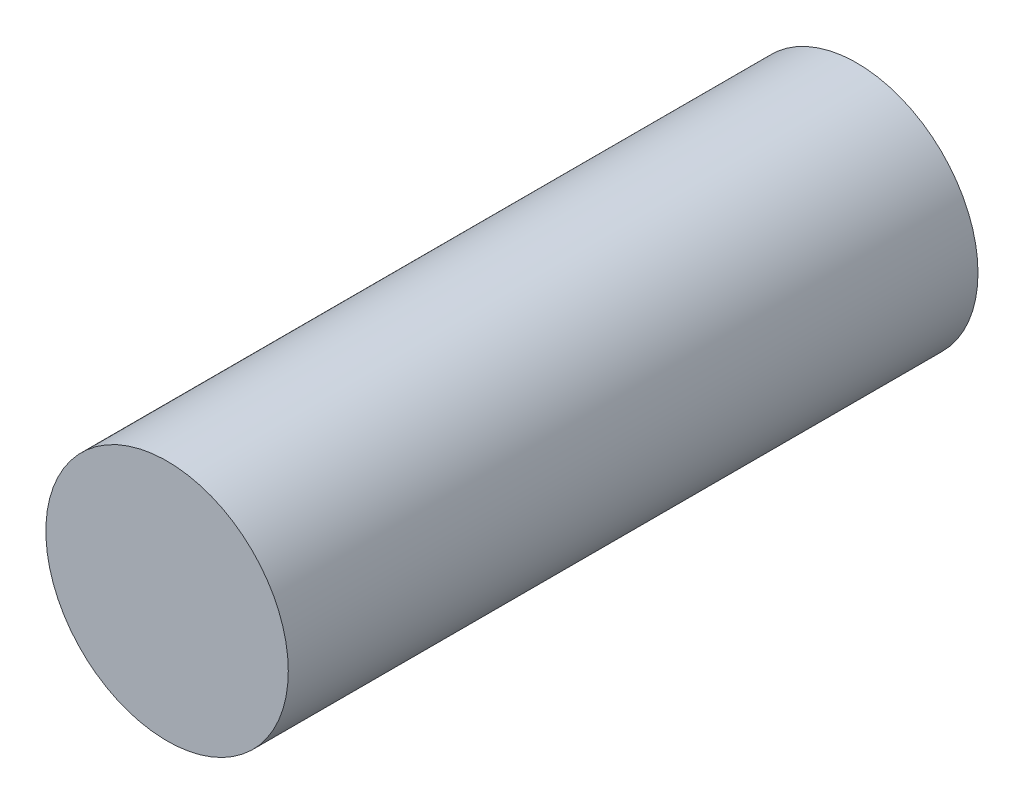
ISO-10303-21;
HEADER;
FILE_DESCRIPTION(('STEP AP214'),'2;1');
FILE_NAME('part.step','',(''),(''),'','','');
FILE_SCHEMA(('AUTOMOTIVE_DESIGN { 1 0 10303 214 1 1 1 1 }'));
ENDSEC;
DATA;
#1=APPLICATION_CONTEXT('core data for automotive mechanical design processes');
#2=APPLICATION_PROTOCOL_DEFINITION('international standard','automotive_design',2000,#1);
#3=PRODUCT_CONTEXT('',#1,'mechanical');
#4=PRODUCT('Part','Part','',(#3));
#5=PRODUCT_RELATED_PRODUCT_CATEGORY('part','',(#4));
#6=PRODUCT_DEFINITION_FORMATION('','',#4);
#7=PRODUCT_DEFINITION_CONTEXT('part definition',#1,'design');
#8=PRODUCT_DEFINITION('design','',#6,#7);
#9=PRODUCT_DEFINITION_SHAPE('','',#8);
#10=(LENGTH_UNIT() NAMED_UNIT(*) SI_UNIT(.MILLI.,.METRE.));
#11=(NAMED_UNIT(*) PLANE_ANGLE_UNIT() SI_UNIT($,.RADIAN.));
#12=(NAMED_UNIT(*) SI_UNIT($,.STERADIAN.) SOLID_ANGLE_UNIT());
#13=UNCERTAINTY_MEASURE_WITH_UNIT(LENGTH_MEASURE(1.E-05),#10,'distance_accuracy_value','');
#14=(GEOMETRIC_REPRESENTATION_CONTEXT(3) GLOBAL_UNCERTAINTY_ASSIGNED_CONTEXT((#13)) GLOBAL_UNIT_ASSIGNED_CONTEXT((#10,
#11,#12)) REPRESENTATION_CONTEXT('',''));
#15=CARTESIAN_POINT('',(0.,0.,0.));
#16=DIRECTION('',(0.,0.,1.));
#17=DIRECTION('',(1.,0.,0.));
#18=AXIS2_PLACEMENT_3D('',#15,#16,#17);
#19=CARTESIAN_POINT('',(0.,0.,71.12));
#20=DIRECTION('',(0.,0.,-1.));
#21=DIRECTION('',(-1.,0.,0.));
#22=AXIS2_PLACEMENT_3D('',#19,#20,#21);
#23=CYLINDRICAL_SURFACE('',#22,12.500000019);
#24=CARTESIAN_POINT('',(0.,0.,71.12));
#25=DIRECTION('',(0.,0.,1.));
#26=DIRECTION('',(1.,0.,0.));
#27=AXIS2_PLACEMENT_3D('',#24,#25,#26);
#28=CIRCLE('',#27,12.500000019);
#29=CARTESIAN_POINT('',(12.500000019,0.,71.12));
#30=VERTEX_POINT('',#29);
#31=EDGE_CURVE('E10',#30,#30,#28,.T.);
#32=ORIENTED_EDGE('',*,*,#31,.F.);
#33=EDGE_LOOP('',(#32));
#34=FACE_BOUND('',#33,.T.);
#35=CARTESIAN_POINT('',(0.,0.,0.));
#36=DIRECTION('',(0.,0.,1.));
#37=DIRECTION('',(1.,0.,0.));
#38=AXIS2_PLACEMENT_3D('',#35,#36,#37);
#39=CIRCLE('',#38,12.500000019);
#40=CARTESIAN_POINT('',(12.500000019,0.,0.));
#41=VERTEX_POINT('',#40);
#42=EDGE_CURVE('E34',#41,#41,#39,.T.);
#43=ORIENTED_EDGE('',*,*,#42,.T.);
#44=EDGE_LOOP('',(#43));
#45=FACE_BOUND('',#44,.T.);
#46=ADVANCED_FACE('F31',(#34,#45),#23,.T.);
#47=CARTESIAN_POINT('',(0.,0.,71.12));
#48=DIRECTION('',(0.,0.,1.));
#49=DIRECTION('',(1.,0.,0.));
#50=AXIS2_PLACEMENT_3D('',#47,#48,#49);
#51=PLANE('',#50);
#52=ORIENTED_EDGE('',*,*,#31,.T.);
#53=EDGE_LOOP('',(#52));
#54=FACE_BOUND('',#53,.T.);
#55=ADVANCED_FACE('F46',(#54),#51,.T.);
#56=CARTESIAN_POINT('',(0.,0.,0.));
#57=DIRECTION('',(0.,0.,1.));
#58=DIRECTION('',(1.,0.,0.));
#59=AXIS2_PLACEMENT_3D('',#56,#57,#58);
#60=PLANE('',#59);
#61=ORIENTED_EDGE('',*,*,#42,.F.);
#62=EDGE_LOOP('',(#61));
#63=FACE_BOUND('',#62,.T.);
#64=ADVANCED_FACE('F44',(#63),#60,.F.);
#65=CLOSED_SHELL('',(#46,#55,#64));
#66=MANIFOLD_SOLID_BREP('B2',#65);
#67=ADVANCED_BREP_SHAPE_REPRESENTATION('',(#18,#66),#14);
#68=SHAPE_DEFINITION_REPRESENTATION(#9,#67);
ENDSEC;
END-ISO-10303-21;
